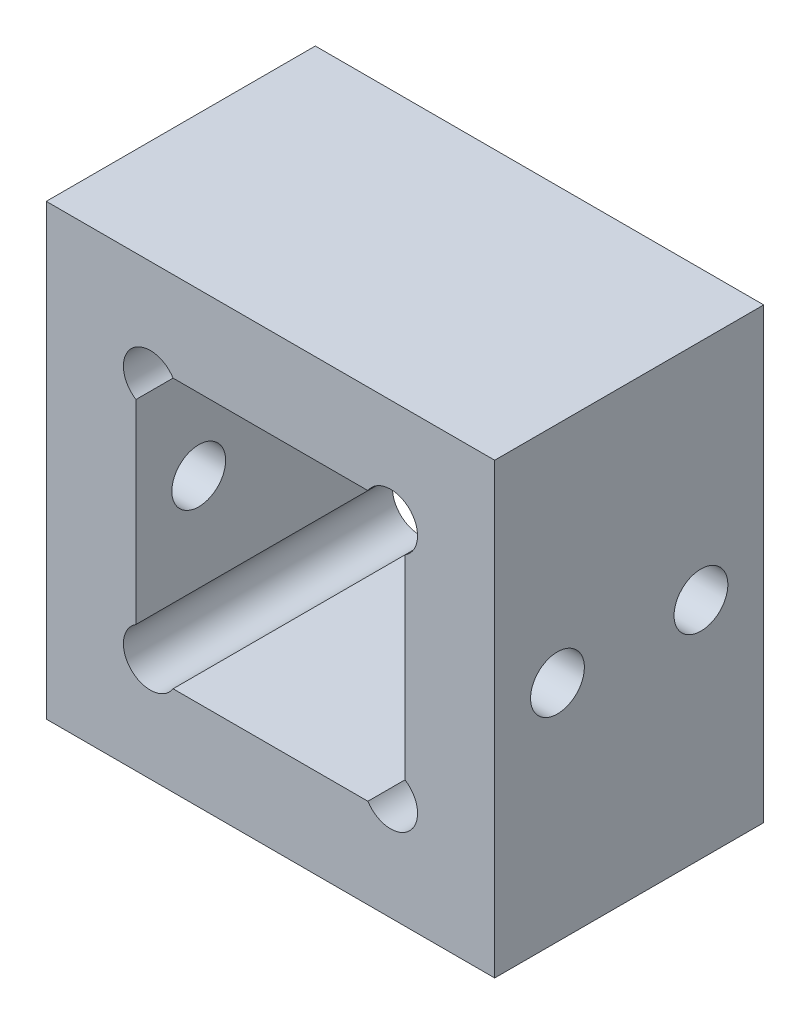
ISO-10303-21;
HEADER;
FILE_DESCRIPTION(('STEP AP214'),'2;1');
FILE_NAME('part.step','',(''),(''),'','','');
FILE_SCHEMA(('AUTOMOTIVE_DESIGN { 1 0 10303 214 1 1 1 1 }'));
ENDSEC;
DATA;
#1=APPLICATION_CONTEXT('core data for automotive mechanical design processes');
#2=APPLICATION_PROTOCOL_DEFINITION('international standard','automotive_design',2000,#1);
#3=PRODUCT_CONTEXT('',#1,'mechanical');
#4=PRODUCT('Part','Part','',(#3));
#5=PRODUCT_RELATED_PRODUCT_CATEGORY('part','',(#4));
#6=PRODUCT_DEFINITION_FORMATION('','',#4);
#7=PRODUCT_DEFINITION_CONTEXT('part definition',#1,'design');
#8=PRODUCT_DEFINITION('design','',#6,#7);
#9=PRODUCT_DEFINITION_SHAPE('','',#8);
#10=(LENGTH_UNIT() NAMED_UNIT(*) SI_UNIT(.MILLI.,.METRE.));
#11=(NAMED_UNIT(*) PLANE_ANGLE_UNIT() SI_UNIT($,.RADIAN.));
#12=(NAMED_UNIT(*) SI_UNIT($,.STERADIAN.) SOLID_ANGLE_UNIT());
#13=UNCERTAINTY_MEASURE_WITH_UNIT(LENGTH_MEASURE(1.E-05),#10,'distance_accuracy_value','');
#14=(GEOMETRIC_REPRESENTATION_CONTEXT(3) GLOBAL_UNCERTAINTY_ASSIGNED_CONTEXT((#13)) GLOBAL_UNIT_ASSIGNED_CONTEXT((#10,
#11,#12)) REPRESENTATION_CONTEXT('',''));
#15=CARTESIAN_POINT('',(0.,0.,0.));
#16=DIRECTION('',(0.,0.,1.));
#17=DIRECTION('',(1.,0.,0.));
#18=AXIS2_PLACEMENT_3D('',#15,#16,#17);
#19=CARTESIAN_POINT('',(0.,0.,15.));
#20=DIRECTION('',(0.,0.,1.));
#21=DIRECTION('',(1.,0.,0.));
#22=AXIS2_PLACEMENT_3D('',#19,#20,#21);
#23=PLANE('',#22);
#24=CARTESIAN_POINT('',(-6.7,6.69999999999999,15.));
#25=DIRECTION('',(0.,0.,1.));
#26=DIRECTION('',(1.,0.,0.));
#27=AXIS2_PLACEMENT_3D('',#24,#25,#26);
#28=CIRCLE('',#27,1.5);
#29=CARTESIAN_POINT('',(-5.43114224595505,7.5,15.));
#30=VERTEX_POINT('',#29);
#31=CARTESIAN_POINT('',(-7.5,5.43114224595504,15.));
#32=VERTEX_POINT('',#31);
#33=EDGE_CURVE('E61',#30,#32,#28,.T.);
#34=ORIENTED_EDGE('',*,*,#33,.F.);
#35=DIRECTION('',(-1.,0.,0.));
#36=VECTOR('',#35,1.);
#37=CARTESIAN_POINT('',(-7.5,7.5,15.));
#38=LINE('',#37,#36);
#39=CARTESIAN_POINT('',(5.43114224595504,7.5,15.));
#40=VERTEX_POINT('',#39);
#41=EDGE_CURVE('E153',#40,#30,#38,.T.);
#42=ORIENTED_EDGE('',*,*,#41,.F.);
#43=CARTESIAN_POINT('',(6.7,6.69999999999999,15.));
#44=DIRECTION('',(0.,0.,1.));
#45=DIRECTION('',(1.,0.,0.));
#46=AXIS2_PLACEMENT_3D('',#43,#44,#45);
#47=CIRCLE('',#46,1.5);
#48=CARTESIAN_POINT('',(7.5,5.43114224595504,15.));
#49=VERTEX_POINT('',#48);
#50=EDGE_CURVE('E53',#49,#40,#47,.T.);
#51=ORIENTED_EDGE('',*,*,#50,.F.);
#52=DIRECTION('',(0.,1.,0.));
#53=VECTOR('',#52,1.);
#54=CARTESIAN_POINT('',(7.5,7.5,15.));
#55=LINE('',#54,#53);
#56=CARTESIAN_POINT('',(7.5,-5.43114224595505,15.));
#57=VERTEX_POINT('',#56);
#58=EDGE_CURVE('E145',#57,#49,#55,.T.);
#59=ORIENTED_EDGE('',*,*,#58,.F.);
#60=CARTESIAN_POINT('',(6.7,-6.7,15.));
#61=DIRECTION('',(0.,0.,1.));
#62=DIRECTION('',(1.,0.,0.));
#63=AXIS2_PLACEMENT_3D('',#60,#61,#62);
#64=CIRCLE('',#63,1.5);
#65=CARTESIAN_POINT('',(5.43114224595505,-7.5,15.));
#66=VERTEX_POINT('',#65);
#67=EDGE_CURVE('E126',#66,#57,#64,.T.);
#68=ORIENTED_EDGE('',*,*,#67,.F.);
#69=DIRECTION('',(1.,0.,0.));
#70=VECTOR('',#69,1.);
#71=CARTESIAN_POINT('',(-7.5,-7.5,15.));
#72=LINE('',#71,#70);
#73=CARTESIAN_POINT('',(-5.43114224595505,-7.5,15.));
#74=VERTEX_POINT('',#73);
#75=EDGE_CURVE('E168',#74,#66,#72,.T.);
#76=ORIENTED_EDGE('',*,*,#75,.F.);
#77=CARTESIAN_POINT('',(-6.7,-6.7,15.));
#78=DIRECTION('',(0.,0.,1.));
#79=DIRECTION('',(1.,0.,0.));
#80=AXIS2_PLACEMENT_3D('',#77,#78,#79);
#81=CIRCLE('',#80,1.5);
#82=CARTESIAN_POINT('',(-7.5,-5.43114224595505,15.));
#83=VERTEX_POINT('',#82);
#84=EDGE_CURVE('E237',#83,#74,#81,.T.);
#85=ORIENTED_EDGE('',*,*,#84,.F.);
#86=DIRECTION('',(0.,-1.,0.));
#87=VECTOR('',#86,1.);
#88=CARTESIAN_POINT('',(-7.5,7.5,15.));
#89=LINE('',#88,#87);
#90=EDGE_CURVE('E157',#32,#83,#89,.T.);
#91=ORIENTED_EDGE('',*,*,#90,.F.);
#92=EDGE_LOOP('',(#34,#42,#51,#59,#68,#76,#85,#91));
#93=FACE_BOUND('',#92,.T.);
#94=DIRECTION('',(0.,-1.,0.));
#95=VECTOR('',#94,1.);
#96=CARTESIAN_POINT('',(-12.5,12.5,15.));
#97=LINE('',#96,#95);
#98=CARTESIAN_POINT('',(-12.5,12.5,15.));
#99=VERTEX_POINT('',#98);
#100=CARTESIAN_POINT('',(-12.5,-12.5,15.));
#101=VERTEX_POINT('',#100);
#102=EDGE_CURVE('E177',#99,#101,#97,.T.);
#103=ORIENTED_EDGE('',*,*,#102,.T.);
#104=DIRECTION('',(1.,0.,0.));
#105=VECTOR('',#104,1.);
#106=CARTESIAN_POINT('',(-12.5,-12.5,15.));
#107=LINE('',#106,#105);
#108=CARTESIAN_POINT('',(12.5,-12.5,15.));
#109=VERTEX_POINT('',#108);
#110=EDGE_CURVE('E180',#101,#109,#107,.T.);
#111=ORIENTED_EDGE('',*,*,#110,.T.);
#112=DIRECTION('',(0.,1.,0.));
#113=VECTOR('',#112,1.);
#114=CARTESIAN_POINT('',(12.5,12.5,15.));
#115=LINE('',#114,#113);
#116=CARTESIAN_POINT('',(12.5,12.5,15.));
#117=VERTEX_POINT('',#116);
#118=EDGE_CURVE('E183',#109,#117,#115,.T.);
#119=ORIENTED_EDGE('',*,*,#118,.T.);
#120=DIRECTION('',(-1.,0.,0.));
#121=VECTOR('',#120,1.);
#122=CARTESIAN_POINT('',(-12.5,12.5,15.));
#123=LINE('',#122,#121);
#124=EDGE_CURVE('E185',#117,#99,#123,.T.);
#125=ORIENTED_EDGE('',*,*,#124,.T.);
#126=EDGE_LOOP('',(#103,#111,#119,#125));
#127=FACE_BOUND('',#126,.T.);
#128=ADVANCED_FACE('F37',(#93,#127),#23,.T.);
#129=CARTESIAN_POINT('',(0.,0.,0.));
#130=DIRECTION('',(0.,0.,1.));
#131=DIRECTION('',(1.,0.,0.));
#132=AXIS2_PLACEMENT_3D('',#129,#130,#131);
#133=PLANE('',#132);
#134=DIRECTION('',(0.,-1.,0.));
#135=VECTOR('',#134,1.);
#136=CARTESIAN_POINT('',(-12.5,12.5,0.));
#137=LINE('',#136,#135);
#138=CARTESIAN_POINT('',(-12.5,12.5,0.));
#139=VERTEX_POINT('',#138);
#140=CARTESIAN_POINT('',(-12.5,-12.5,0.));
#141=VERTEX_POINT('',#140);
#142=EDGE_CURVE('E170',#139,#141,#137,.T.);
#143=ORIENTED_EDGE('',*,*,#142,.F.);
#144=DIRECTION('',(-1.,0.,0.));
#145=VECTOR('',#144,1.);
#146=CARTESIAN_POINT('',(-12.5,12.5,0.));
#147=LINE('',#146,#145);
#148=CARTESIAN_POINT('',(12.5,12.5,0.));
#149=VERTEX_POINT('',#148);
#150=EDGE_CURVE('E181',#149,#139,#147,.T.);
#151=ORIENTED_EDGE('',*,*,#150,.F.);
#152=DIRECTION('',(0.,1.,0.));
#153=VECTOR('',#152,1.);
#154=CARTESIAN_POINT('',(12.5,12.5,0.));
#155=LINE('',#154,#153);
#156=CARTESIAN_POINT('',(12.5,-12.5,0.));
#157=VERTEX_POINT('',#156);
#158=EDGE_CURVE('E192',#157,#149,#155,.T.);
#159=ORIENTED_EDGE('',*,*,#158,.F.);
#160=DIRECTION('',(1.,0.,0.));
#161=VECTOR('',#160,1.);
#162=CARTESIAN_POINT('',(-12.5,-12.5,0.));
#163=LINE('',#162,#161);
#164=EDGE_CURVE('E190',#141,#157,#163,.T.);
#165=ORIENTED_EDGE('',*,*,#164,.F.);
#166=EDGE_LOOP('',(#143,#151,#159,#165));
#167=FACE_BOUND('',#166,.T.);
#168=DIRECTION('',(-1.,0.,0.));
#169=VECTOR('',#168,1.);
#170=CARTESIAN_POINT('',(-7.5,7.5,0.));
#171=LINE('',#170,#169);
#172=CARTESIAN_POINT('',(5.43114224595505,7.5,0.));
#173=VERTEX_POINT('',#172);
#174=CARTESIAN_POINT('',(-5.43114224595505,7.5,0.));
#175=VERTEX_POINT('',#174);
#176=EDGE_CURVE('E172',#173,#175,#171,.T.);
#177=ORIENTED_EDGE('',*,*,#176,.T.);
#178=CARTESIAN_POINT('',(-6.7,6.69999999999999,0.));
#179=DIRECTION('',(0.,0.,1.));
#180=DIRECTION('',(1.,0.,0.));
#181=AXIS2_PLACEMENT_3D('',#178,#179,#180);
#182=CIRCLE('',#181,1.5);
#183=CARTESIAN_POINT('',(-7.5,5.43114224595504,0.));
#184=VERTEX_POINT('',#183);
#185=EDGE_CURVE('E239',#175,#184,#182,.T.);
#186=ORIENTED_EDGE('',*,*,#185,.T.);
#187=DIRECTION('',(0.,-1.,0.));
#188=VECTOR('',#187,1.);
#189=CARTESIAN_POINT('',(-7.5,7.5,0.));
#190=LINE('',#189,#188);
#191=CARTESIAN_POINT('',(-7.5,-5.43114224595505,0.));
#192=VERTEX_POINT('',#191);
#193=EDGE_CURVE('E160',#184,#192,#190,.T.);
#194=ORIENTED_EDGE('',*,*,#193,.T.);
#195=CARTESIAN_POINT('',(-6.7,-6.7,0.));
#196=DIRECTION('',(0.,0.,1.));
#197=DIRECTION('',(1.,0.,0.));
#198=AXIS2_PLACEMENT_3D('',#195,#196,#197);
#199=CIRCLE('',#198,1.5);
#200=CARTESIAN_POINT('',(-5.43114224595505,-7.5,0.));
#201=VERTEX_POINT('',#200);
#202=EDGE_CURVE('E138',#192,#201,#199,.T.);
#203=ORIENTED_EDGE('',*,*,#202,.T.);
#204=DIRECTION('',(1.,0.,0.));
#205=VECTOR('',#204,1.);
#206=CARTESIAN_POINT('',(-7.5,-7.5,0.));
#207=LINE('',#206,#205);
#208=CARTESIAN_POINT('',(5.43114224595504,-7.5,0.));
#209=VERTEX_POINT('',#208);
#210=EDGE_CURVE('E154',#201,#209,#207,.T.);
#211=ORIENTED_EDGE('',*,*,#210,.T.);
#212=CARTESIAN_POINT('',(6.7,-6.7,0.));
#213=DIRECTION('',(0.,0.,1.));
#214=DIRECTION('',(1.,0.,0.));
#215=AXIS2_PLACEMENT_3D('',#212,#213,#214);
#216=CIRCLE('',#215,1.5);
#217=CARTESIAN_POINT('',(7.5,-5.43114224595505,0.));
#218=VERTEX_POINT('',#217);
#219=EDGE_CURVE('E137',#209,#218,#216,.T.);
#220=ORIENTED_EDGE('',*,*,#219,.T.);
#221=DIRECTION('',(0.,1.,0.));
#222=VECTOR('',#221,1.);
#223=CARTESIAN_POINT('',(7.5,7.5,0.));
#224=LINE('',#223,#222);
#225=CARTESIAN_POINT('',(7.5,5.43114224595504,0.));
#226=VERTEX_POINT('',#225);
#227=EDGE_CURVE('E147',#218,#226,#224,.T.);
#228=ORIENTED_EDGE('',*,*,#227,.T.);
#229=CARTESIAN_POINT('',(6.7,6.69999999999999,0.));
#230=DIRECTION('',(0.,0.,1.));
#231=DIRECTION('',(1.,0.,0.));
#232=AXIS2_PLACEMENT_3D('',#229,#230,#231);
#233=CIRCLE('',#232,1.5);
#234=EDGE_CURVE('E149',#226,#173,#233,.T.);
#235=ORIENTED_EDGE('',*,*,#234,.T.);
#236=EDGE_LOOP('',(#177,#186,#194,#203,#211,#220,#228,#235));
#237=FACE_BOUND('',#236,.T.);
#238=ADVANCED_FACE('F250',(#167,#237),#133,.F.);
#239=CARTESIAN_POINT('',(-12.5,12.5,15.));
#240=DIRECTION('',(1.,0.,0.));
#241=DIRECTION('',(0.,1.,0.));
#242=AXIS2_PLACEMENT_3D('',#239,#240,#241);
#243=PLANE('',#242);
#244=CARTESIAN_POINT('',(-12.5,0.,11.5));
#245=DIRECTION('',(1.,0.,0.));
#246=DIRECTION('',(0.,1.,0.));
#247=AXIS2_PLACEMENT_3D('',#244,#245,#246);
#248=CIRCLE('',#247,1.5);
#249=CARTESIAN_POINT('',(-12.5,1.5,11.5));
#250=VERTEX_POINT('',#249);
#251=EDGE_CURVE('E212',#250,#250,#248,.T.);
#252=ORIENTED_EDGE('',*,*,#251,.T.);
#253=EDGE_LOOP('',(#252));
#254=FACE_BOUND('',#253,.T.);
#255=CARTESIAN_POINT('',(-12.5,0.,3.5));
#256=DIRECTION('',(1.,0.,0.));
#257=DIRECTION('',(0.,-1.,0.));
#258=AXIS2_PLACEMENT_3D('',#255,#256,#257);
#259=CIRCLE('',#258,1.5);
#260=CARTESIAN_POINT('',(-12.5,-1.5,3.5));
#261=VERTEX_POINT('',#260);
#262=EDGE_CURVE('E223',#261,#261,#259,.T.);
#263=ORIENTED_EDGE('',*,*,#262,.T.);
#264=EDGE_LOOP('',(#263));
#265=FACE_BOUND('',#264,.T.);
#266=ORIENTED_EDGE('',*,*,#142,.T.);
#267=DIRECTION('',(0.,0.,-1.));
#268=VECTOR('',#267,1.);
#269=CARTESIAN_POINT('',(-12.5,-12.5,15.));
#270=LINE('',#269,#268);
#271=EDGE_CURVE('E203',#101,#141,#270,.T.);
#272=ORIENTED_EDGE('',*,*,#271,.F.);
#273=ORIENTED_EDGE('',*,*,#102,.F.);
#274=DIRECTION('',(0.,0.,-1.));
#275=VECTOR('',#274,1.);
#276=CARTESIAN_POINT('',(-12.5,12.5,15.));
#277=LINE('',#276,#275);
#278=EDGE_CURVE('E187',#99,#139,#277,.T.);
#279=ORIENTED_EDGE('',*,*,#278,.T.);
#280=EDGE_LOOP('',(#266,#272,#273,#279));
#281=FACE_BOUND('',#280,.T.);
#282=ADVANCED_FACE('F39',(#254,#265,#281),#243,.F.);
#283=CARTESIAN_POINT('',(-12.5,-12.5,15.));
#284=DIRECTION('',(0.,1.,0.));
#285=DIRECTION('',(0.,0.,1.));
#286=AXIS2_PLACEMENT_3D('',#283,#284,#285);
#287=PLANE('',#286);
#288=ORIENTED_EDGE('',*,*,#164,.T.);
#289=DIRECTION('',(0.,0.,-1.));
#290=VECTOR('',#289,1.);
#291=CARTESIAN_POINT('',(12.5,-12.5,15.));
#292=LINE('',#291,#290);
#293=EDGE_CURVE('E200',#109,#157,#292,.T.);
#294=ORIENTED_EDGE('',*,*,#293,.F.);
#295=ORIENTED_EDGE('',*,*,#110,.F.);
#296=ORIENTED_EDGE('',*,*,#271,.T.);
#297=EDGE_LOOP('',(#288,#294,#295,#296));
#298=FACE_BOUND('',#297,.T.);
#299=ADVANCED_FACE('F290',(#298),#287,.F.);
#300=CARTESIAN_POINT('',(12.5,12.5,15.));
#301=DIRECTION('',(-1.,0.,0.));
#302=DIRECTION('',(0.,-1.,0.));
#303=AXIS2_PLACEMENT_3D('',#300,#301,#302);
#304=PLANE('',#303);
#305=CARTESIAN_POINT('',(12.5,0.,11.5));
#306=DIRECTION('',(1.,0.,0.));
#307=DIRECTION('',(0.,1.,0.));
#308=AXIS2_PLACEMENT_3D('',#305,#306,#307);
#309=CIRCLE('',#308,1.5);
#310=CARTESIAN_POINT('',(12.5,1.5,11.5));
#311=VERTEX_POINT('',#310);
#312=EDGE_CURVE('E218',#311,#311,#309,.T.);
#313=ORIENTED_EDGE('',*,*,#312,.F.);
#314=EDGE_LOOP('',(#313));
#315=FACE_BOUND('',#314,.T.);
#316=CARTESIAN_POINT('',(12.5,0.,3.5));
#317=DIRECTION('',(1.,0.,0.));
#318=DIRECTION('',(0.,-1.,0.));
#319=AXIS2_PLACEMENT_3D('',#316,#317,#318);
#320=CIRCLE('',#319,1.5);
#321=CARTESIAN_POINT('',(12.5,-1.5,3.5));
#322=VERTEX_POINT('',#321);
#323=EDGE_CURVE('E228',#322,#322,#320,.T.);
#324=ORIENTED_EDGE('',*,*,#323,.F.);
#325=EDGE_LOOP('',(#324));
#326=FACE_BOUND('',#325,.T.);
#327=ORIENTED_EDGE('',*,*,#158,.T.);
#328=DIRECTION('',(0.,0.,-1.));
#329=VECTOR('',#328,1.);
#330=CARTESIAN_POINT('',(12.5,12.5,15.));
#331=LINE('',#330,#329);
#332=EDGE_CURVE('E197',#117,#149,#331,.T.);
#333=ORIENTED_EDGE('',*,*,#332,.F.);
#334=ORIENTED_EDGE('',*,*,#118,.F.);
#335=ORIENTED_EDGE('',*,*,#293,.T.);
#336=EDGE_LOOP('',(#327,#333,#334,#335));
#337=FACE_BOUND('',#336,.T.);
#338=ADVANCED_FACE('F287',(#315,#326,#337),#304,.F.);
#339=CARTESIAN_POINT('',(-12.5,12.5,15.));
#340=DIRECTION('',(0.,-1.,0.));
#341=DIRECTION('',(0.,0.,-1.));
#342=AXIS2_PLACEMENT_3D('',#339,#340,#341);
#343=PLANE('',#342);
#344=ORIENTED_EDGE('',*,*,#150,.T.);
#345=ORIENTED_EDGE('',*,*,#278,.F.);
#346=ORIENTED_EDGE('',*,*,#124,.F.);
#347=ORIENTED_EDGE('',*,*,#332,.T.);
#348=EDGE_LOOP('',(#344,#345,#346,#347));
#349=FACE_BOUND('',#348,.T.);
#350=ADVANCED_FACE('F274',(#349),#343,.F.);
#351=CARTESIAN_POINT('',(7.5,7.5,15.));
#352=DIRECTION('',(-1.,0.,0.));
#353=DIRECTION('',(0.,-1.,0.));
#354=AXIS2_PLACEMENT_3D('',#351,#352,#353);
#355=PLANE('',#354);
#356=CARTESIAN_POINT('',(7.5,0.,11.5));
#357=DIRECTION('',(-1.,0.,0.));
#358=DIRECTION('',(0.,-1.,0.));
#359=AXIS2_PLACEMENT_3D('',#356,#357,#358);
#360=CIRCLE('',#359,1.5);
#361=CARTESIAN_POINT('',(7.5,-1.5,11.5));
#362=VERTEX_POINT('',#361);
#363=EDGE_CURVE('E231',#362,#362,#360,.T.);
#364=ORIENTED_EDGE('',*,*,#363,.F.);
#365=EDGE_LOOP('',(#364));
#366=FACE_BOUND('',#365,.T.);
#367=CARTESIAN_POINT('',(7.5,0.,3.5));
#368=DIRECTION('',(-1.,0.,0.));
#369=DIRECTION('',(0.,-1.,0.));
#370=AXIS2_PLACEMENT_3D('',#367,#368,#369);
#371=CIRCLE('',#370,1.5);
#372=CARTESIAN_POINT('',(7.5,-1.5,3.5));
#373=VERTEX_POINT('',#372);
#374=EDGE_CURVE('E211',#373,#373,#371,.T.);
#375=ORIENTED_EDGE('',*,*,#374,.F.);
#376=EDGE_LOOP('',(#375));
#377=FACE_BOUND('',#376,.T.);
#378=DIRECTION('',(0.,0.,1.));
#379=VECTOR('',#378,1.);
#380=CARTESIAN_POINT('',(7.5,-5.43114224595505,0.));
#381=LINE('',#380,#379);
#382=EDGE_CURVE('E129',#57,#218,#381,.F.);
#383=ORIENTED_EDGE('',*,*,#382,.F.);
#384=ORIENTED_EDGE('',*,*,#58,.T.);
#385=DIRECTION('',(0.,0.,1.));
#386=VECTOR('',#385,1.);
#387=CARTESIAN_POINT('',(7.5,5.43114224595504,0.));
#388=LINE('',#387,#386);
#389=EDGE_CURVE('E163',#226,#49,#388,.T.);
#390=ORIENTED_EDGE('',*,*,#389,.F.);
#391=ORIENTED_EDGE('',*,*,#227,.F.);
#392=EDGE_LOOP('',(#383,#384,#390,#391));
#393=FACE_BOUND('',#392,.T.);
#394=ADVANCED_FACE('F143',(#366,#377,#393),#355,.T.);
#395=CARTESIAN_POINT('',(-7.5,7.5,15.));
#396=DIRECTION('',(0.,-1.,0.));
#397=DIRECTION('',(0.,0.,-1.));
#398=AXIS2_PLACEMENT_3D('',#395,#396,#397);
#399=PLANE('',#398);
#400=DIRECTION('',(0.,0.,1.));
#401=VECTOR('',#400,1.);
#402=CARTESIAN_POINT('',(-5.43114224595505,7.5,0.));
#403=LINE('',#402,#401);
#404=EDGE_CURVE('E246',#175,#30,#403,.T.);
#405=ORIENTED_EDGE('',*,*,#404,.F.);
#406=ORIENTED_EDGE('',*,*,#176,.F.);
#407=DIRECTION('',(0.,0.,1.));
#408=VECTOR('',#407,1.);
#409=CARTESIAN_POINT('',(5.43114224595505,7.5,0.));
#410=LINE('',#409,#408);
#411=EDGE_CURVE('E11',#40,#173,#410,.F.);
#412=ORIENTED_EDGE('',*,*,#411,.F.);
#413=ORIENTED_EDGE('',*,*,#41,.T.);
#414=EDGE_LOOP('',(#405,#406,#412,#413));
#415=FACE_BOUND('',#414,.T.);
#416=ADVANCED_FACE('F265',(#415),#399,.T.);
#417=CARTESIAN_POINT('',(-7.5,7.5,15.));
#418=DIRECTION('',(1.,0.,0.));
#419=DIRECTION('',(0.,0.,-1.));
#420=AXIS2_PLACEMENT_3D('',#417,#418,#419);
#421=PLANE('',#420);
#422=CARTESIAN_POINT('',(-7.5,0.,11.5));
#423=DIRECTION('',(1.,0.,0.));
#424=DIRECTION('',(0.,0.,-1.));
#425=AXIS2_PLACEMENT_3D('',#422,#423,#424);
#426=CIRCLE('',#425,1.5);
#427=CARTESIAN_POINT('',(-7.5,0.,10.));
#428=VERTEX_POINT('',#427);
#429=EDGE_CURVE('E41',#428,#428,#426,.T.);
#430=ORIENTED_EDGE('',*,*,#429,.F.);
#431=EDGE_LOOP('',(#430));
#432=FACE_BOUND('',#431,.T.);
#433=CARTESIAN_POINT('',(-7.5,0.,3.5));
#434=DIRECTION('',(1.,0.,0.));
#435=DIRECTION('',(0.,0.,-1.));
#436=AXIS2_PLACEMENT_3D('',#433,#434,#435);
#437=CIRCLE('',#436,1.5);
#438=CARTESIAN_POINT('',(-7.5,0.,2.));
#439=VERTEX_POINT('',#438);
#440=EDGE_CURVE('E209',#439,#439,#437,.T.);
#441=ORIENTED_EDGE('',*,*,#440,.F.);
#442=EDGE_LOOP('',(#441));
#443=FACE_BOUND('',#442,.T.);
#444=DIRECTION('',(0.,0.,1.));
#445=VECTOR('',#444,1.);
#446=CARTESIAN_POINT('',(-7.5,5.43114224595504,0.));
#447=LINE('',#446,#445);
#448=EDGE_CURVE('E46',#32,#184,#447,.F.);
#449=ORIENTED_EDGE('',*,*,#448,.F.);
#450=ORIENTED_EDGE('',*,*,#90,.T.);
#451=DIRECTION('',(0.,0.,1.));
#452=VECTOR('',#451,1.);
#453=CARTESIAN_POINT('',(-7.5,-5.43114224595505,0.));
#454=LINE('',#453,#452);
#455=EDGE_CURVE('E148',#192,#83,#454,.T.);
#456=ORIENTED_EDGE('',*,*,#455,.F.);
#457=ORIENTED_EDGE('',*,*,#193,.F.);
#458=EDGE_LOOP('',(#449,#450,#456,#457));
#459=FACE_BOUND('',#458,.T.);
#460=ADVANCED_FACE('F261',(#432,#443,#459),#421,.T.);
#461=CARTESIAN_POINT('',(-7.5,-7.5,15.));
#462=DIRECTION('',(0.,1.,0.));
#463=DIRECTION('',(0.,0.,1.));
#464=AXIS2_PLACEMENT_3D('',#461,#462,#463);
#465=PLANE('',#464);
#466=DIRECTION('',(0.,0.,1.));
#467=VECTOR('',#466,1.);
#468=CARTESIAN_POINT('',(-5.43114224595505,-7.5,0.));
#469=LINE('',#468,#467);
#470=EDGE_CURVE('E207',#74,#201,#469,.F.);
#471=ORIENTED_EDGE('',*,*,#470,.F.);
#472=ORIENTED_EDGE('',*,*,#75,.T.);
#473=DIRECTION('',(0.,0.,1.));
#474=VECTOR('',#473,1.);
#475=CARTESIAN_POINT('',(5.43114224595505,-7.5,0.));
#476=LINE('',#475,#474);
#477=EDGE_CURVE('E132',#209,#66,#476,.T.);
#478=ORIENTED_EDGE('',*,*,#477,.F.);
#479=ORIENTED_EDGE('',*,*,#210,.F.);
#480=EDGE_LOOP('',(#471,#472,#478,#479));
#481=FACE_BOUND('',#480,.T.);
#482=ADVANCED_FACE('F255',(#481),#465,.T.);
#483=CARTESIAN_POINT('',(6.7,-6.7,0.));
#484=DIRECTION('',(0.,0.,1.));
#485=DIRECTION('',(1.,0.,0.));
#486=AXIS2_PLACEMENT_3D('',#483,#484,#485);
#487=CYLINDRICAL_SURFACE('',#486,1.5);
#488=ORIENTED_EDGE('',*,*,#382,.T.);
#489=ORIENTED_EDGE('',*,*,#219,.F.);
#490=ORIENTED_EDGE('',*,*,#477,.T.);
#491=ORIENTED_EDGE('',*,*,#67,.T.);
#492=EDGE_LOOP('',(#488,#489,#490,#491));
#493=FACE_BOUND('',#492,.T.);
#494=ADVANCED_FACE('F128',(#493),#487,.F.);
#495=CARTESIAN_POINT('',(-6.7,-6.7,0.));
#496=DIRECTION('',(0.,0.,1.));
#497=DIRECTION('',(1.,0.,0.));
#498=AXIS2_PLACEMENT_3D('',#495,#496,#497);
#499=CYLINDRICAL_SURFACE('',#498,1.5);
#500=ORIENTED_EDGE('',*,*,#455,.T.);
#501=ORIENTED_EDGE('',*,*,#84,.T.);
#502=ORIENTED_EDGE('',*,*,#470,.T.);
#503=ORIENTED_EDGE('',*,*,#202,.F.);
#504=EDGE_LOOP('',(#500,#501,#502,#503));
#505=FACE_BOUND('',#504,.T.);
#506=ADVANCED_FACE('F401',(#505),#499,.F.);
#507=CARTESIAN_POINT('',(-6.7,6.69999999999999,0.));
#508=DIRECTION('',(0.,0.,1.));
#509=DIRECTION('',(1.,0.,0.));
#510=AXIS2_PLACEMENT_3D('',#507,#508,#509);
#511=CYLINDRICAL_SURFACE('',#510,1.5);
#512=ORIENTED_EDGE('',*,*,#404,.T.);
#513=ORIENTED_EDGE('',*,*,#33,.T.);
#514=ORIENTED_EDGE('',*,*,#448,.T.);
#515=ORIENTED_EDGE('',*,*,#185,.F.);
#516=EDGE_LOOP('',(#512,#513,#514,#515));
#517=FACE_BOUND('',#516,.T.);
#518=ADVANCED_FACE('F263',(#517),#511,.F.);
#519=CARTESIAN_POINT('',(6.7,6.69999999999999,0.));
#520=DIRECTION('',(0.,0.,1.));
#521=DIRECTION('',(1.,0.,0.));
#522=AXIS2_PLACEMENT_3D('',#519,#520,#521);
#523=CYLINDRICAL_SURFACE('',#522,1.5);
#524=ORIENTED_EDGE('',*,*,#389,.T.);
#525=ORIENTED_EDGE('',*,*,#50,.T.);
#526=ORIENTED_EDGE('',*,*,#411,.T.);
#527=ORIENTED_EDGE('',*,*,#234,.F.);
#528=EDGE_LOOP('',(#524,#525,#526,#527));
#529=FACE_BOUND('',#528,.T.);
#530=ADVANCED_FACE('F248',(#529),#523,.F.);
#531=CARTESIAN_POINT('',(-12.5,0.,3.5));
#532=DIRECTION('',(1.,0.,0.));
#533=DIRECTION('',(0.,1.,0.));
#534=AXIS2_PLACEMENT_3D('',#531,#532,#533);
#535=CYLINDRICAL_SURFACE('',#534,1.5);
#536=ORIENTED_EDGE('',*,*,#440,.T.);
#537=EDGE_LOOP('',(#536));
#538=FACE_BOUND('',#537,.T.);
#539=ORIENTED_EDGE('',*,*,#262,.F.);
#540=EDGE_LOOP('',(#539));
#541=FACE_BOUND('',#540,.T.);
#542=ADVANCED_FACE('F314',(#538,#541),#535,.F.);
#543=CARTESIAN_POINT('',(-12.5,0.,11.5));
#544=DIRECTION('',(1.,0.,0.));
#545=DIRECTION('',(0.,1.,0.));
#546=AXIS2_PLACEMENT_3D('',#543,#544,#545);
#547=CYLINDRICAL_SURFACE('',#546,1.5);
#548=ORIENTED_EDGE('',*,*,#429,.T.);
#549=EDGE_LOOP('',(#548));
#550=FACE_BOUND('',#549,.T.);
#551=ORIENTED_EDGE('',*,*,#251,.F.);
#552=EDGE_LOOP('',(#551));
#553=FACE_BOUND('',#552,.T.);
#554=ADVANCED_FACE('F316',(#550,#553),#547,.F.);
#555=ORIENTED_EDGE('',*,*,#374,.T.);
#556=EDGE_LOOP('',(#555));
#557=FACE_BOUND('',#556,.T.);
#558=ORIENTED_EDGE('',*,*,#323,.T.);
#559=EDGE_LOOP('',(#558));
#560=FACE_BOUND('',#559,.T.);
#561=ADVANCED_FACE('F318',(#557,#560),#535,.F.);
#562=ORIENTED_EDGE('',*,*,#363,.T.);
#563=EDGE_LOOP('',(#562));
#564=FACE_BOUND('',#563,.T.);
#565=ORIENTED_EDGE('',*,*,#312,.T.);
#566=EDGE_LOOP('',(#565));
#567=FACE_BOUND('',#566,.T.);
#568=ADVANCED_FACE('F325',(#564,#567),#547,.F.);
#569=CLOSED_SHELL('',(#128,#238,#282,#299,#338,#350,#394,#416,#460,#482,#494,#506,#518,#530,
#542,#554,#561,#568));
#570=MANIFOLD_SOLID_BREP('B2',#569);
#571=ADVANCED_BREP_SHAPE_REPRESENTATION('',(#18,#570),#14);
#572=SHAPE_DEFINITION_REPRESENTATION(#9,#571);
ENDSEC;
END-ISO-10303-21;
